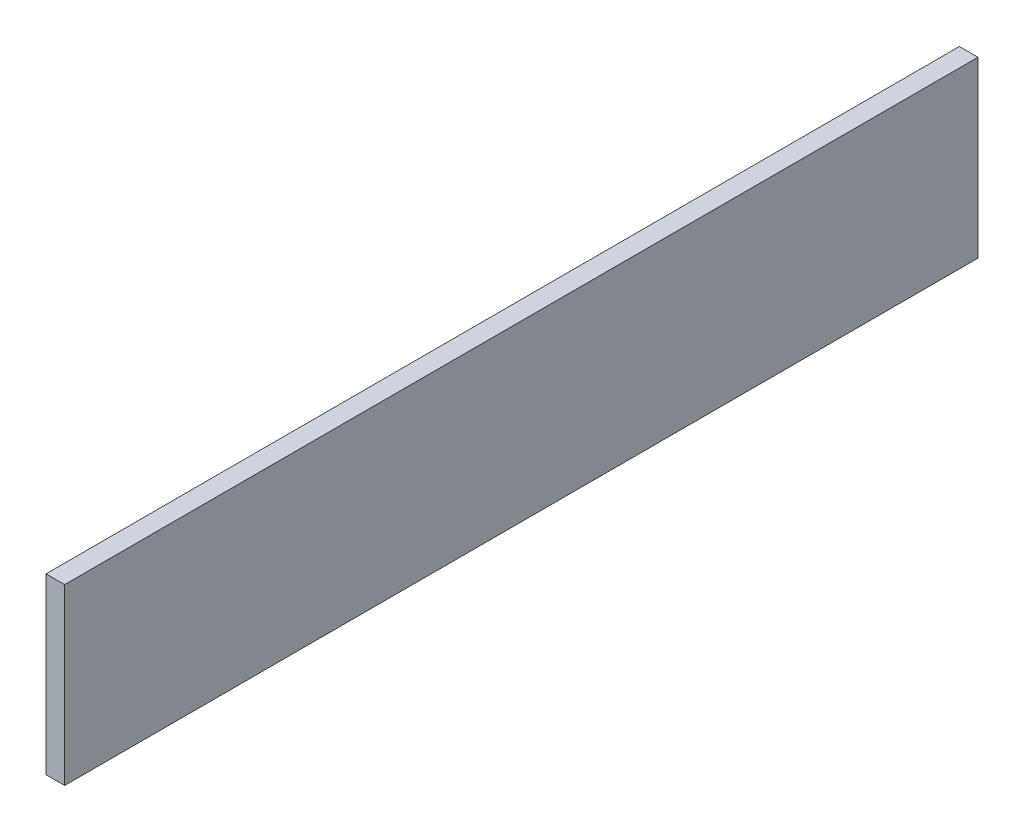
ISO-10303-21;
HEADER;
FILE_DESCRIPTION(('STEP AP214'),'2;1');
FILE_NAME('part.step','',(''),(''),'','','');
FILE_SCHEMA(('AUTOMOTIVE_DESIGN { 1 0 10303 214 1 1 1 1 }'));
ENDSEC;
DATA;
#1=APPLICATION_CONTEXT('core data for automotive mechanical design processes');
#2=APPLICATION_PROTOCOL_DEFINITION('international standard','automotive_design',2000,#1);
#3=PRODUCT_CONTEXT('',#1,'mechanical');
#4=PRODUCT('Part','Part','',(#3));
#5=PRODUCT_RELATED_PRODUCT_CATEGORY('part','',(#4));
#6=PRODUCT_DEFINITION_FORMATION('','',#4);
#7=PRODUCT_DEFINITION_CONTEXT('part definition',#1,'design');
#8=PRODUCT_DEFINITION('design','',#6,#7);
#9=PRODUCT_DEFINITION_SHAPE('','',#8);
#10=(LENGTH_UNIT() NAMED_UNIT(*) SI_UNIT(.MILLI.,.METRE.));
#11=(NAMED_UNIT(*) PLANE_ANGLE_UNIT() SI_UNIT($,.RADIAN.));
#12=(NAMED_UNIT(*) SI_UNIT($,.STERADIAN.) SOLID_ANGLE_UNIT());
#13=UNCERTAINTY_MEASURE_WITH_UNIT(LENGTH_MEASURE(1.E-05),#10,'distance_accuracy_value','');
#14=(GEOMETRIC_REPRESENTATION_CONTEXT(3) GLOBAL_UNCERTAINTY_ASSIGNED_CONTEXT((#13)) GLOBAL_UNIT_ASSIGNED_CONTEXT((#10,
#11,#12)) REPRESENTATION_CONTEXT('',''));
#15=CARTESIAN_POINT('',(0.,0.,0.));
#16=DIRECTION('',(0.,0.,1.));
#17=DIRECTION('',(1.,0.,0.));
#18=AXIS2_PLACEMENT_3D('',#15,#16,#17);
#19=CARTESIAN_POINT('',(-3.,0.,0.));
#20=DIRECTION('',(0.,0.,1.));
#21=DIRECTION('',(1.,0.,0.));
#22=AXIS2_PLACEMENT_3D('',#19,#20,#21);
#23=PLANE('',#22);
#24=DIRECTION('',(0.,-1.,0.));
#25=VECTOR('',#24,1.);
#26=CARTESIAN_POINT('',(0.,0.,0.));
#27=LINE('',#26,#25);
#28=CARTESIAN_POINT('',(0.,28.,0.));
#29=VERTEX_POINT('',#28);
#30=CARTESIAN_POINT('',(0.,0.,0.));
#31=VERTEX_POINT('',#30);
#32=EDGE_CURVE('E99',#29,#31,#27,.T.);
#33=ORIENTED_EDGE('',*,*,#32,.F.);
#34=DIRECTION('',(1.,0.,0.));
#35=VECTOR('',#34,1.);
#36=CARTESIAN_POINT('',(-3.,28.,0.));
#37=LINE('',#36,#35);
#38=CARTESIAN_POINT('',(-3.,28.,0.));
#39=VERTEX_POINT('',#38);
#40=EDGE_CURVE('E11',#39,#29,#37,.T.);
#41=ORIENTED_EDGE('',*,*,#40,.F.);
#42=DIRECTION('',(0.,-1.,0.));
#43=VECTOR('',#42,1.);
#44=CARTESIAN_POINT('',(-3.,0.,0.));
#45=LINE('',#44,#43);
#46=CARTESIAN_POINT('',(-3.,0.,0.));
#47=VERTEX_POINT('',#46);
#48=EDGE_CURVE('E93',#39,#47,#45,.T.);
#49=ORIENTED_EDGE('',*,*,#48,.T.);
#50=DIRECTION('',(1.,0.,0.));
#51=VECTOR('',#50,1.);
#52=CARTESIAN_POINT('',(-3.,0.,0.));
#53=LINE('',#52,#51);
#54=EDGE_CURVE('E38',#47,#31,#53,.T.);
#55=ORIENTED_EDGE('',*,*,#54,.T.);
#56=EDGE_LOOP('',(#33,#41,#49,#55));
#57=FACE_BOUND('',#56,.T.);
#58=ADVANCED_FACE('F35',(#57),#23,.T.);
#59=CARTESIAN_POINT('',(-3.,28.,0.));
#60=DIRECTION('',(0.,1.,0.));
#61=DIRECTION('',(0.,0.,1.));
#62=AXIS2_PLACEMENT_3D('',#59,#60,#61);
#63=PLANE('',#62);
#64=DIRECTION('',(0.,0.,1.));
#65=VECTOR('',#64,1.);
#66=CARTESIAN_POINT('',(0.,28.,0.));
#67=LINE('',#66,#65);
#68=CARTESIAN_POINT('',(0.,28.,-147.));
#69=VERTEX_POINT('',#68);
#70=EDGE_CURVE('E95',#69,#29,#67,.T.);
#71=ORIENTED_EDGE('',*,*,#70,.F.);
#72=DIRECTION('',(1.,0.,0.));
#73=VECTOR('',#72,1.);
#74=CARTESIAN_POINT('',(-3.,28.,-147.));
#75=LINE('',#74,#73);
#76=CARTESIAN_POINT('',(-3.,28.,-147.));
#77=VERTEX_POINT('',#76);
#78=EDGE_CURVE('E44',#77,#69,#75,.T.);
#79=ORIENTED_EDGE('',*,*,#78,.F.);
#80=DIRECTION('',(0.,0.,1.));
#81=VECTOR('',#80,1.);
#82=CARTESIAN_POINT('',(-3.,28.,0.));
#83=LINE('',#82,#81);
#84=EDGE_CURVE('E90',#77,#39,#83,.T.);
#85=ORIENTED_EDGE('',*,*,#84,.T.);
#86=ORIENTED_EDGE('',*,*,#40,.T.);
#87=EDGE_LOOP('',(#71,#79,#85,#86));
#88=FACE_BOUND('',#87,.T.);
#89=ADVANCED_FACE('F109',(#88),#63,.T.);
#90=CARTESIAN_POINT('',(-3.,0.,-147.));
#91=DIRECTION('',(0.,0.,-1.));
#92=DIRECTION('',(-1.,0.,0.));
#93=AXIS2_PLACEMENT_3D('',#90,#91,#92);
#94=PLANE('',#93);
#95=DIRECTION('',(0.,1.,0.));
#96=VECTOR('',#95,1.);
#97=CARTESIAN_POINT('',(0.,0.,-147.));
#98=LINE('',#97,#96);
#99=CARTESIAN_POINT('',(0.,0.,-147.));
#100=VERTEX_POINT('',#99);
#101=EDGE_CURVE('E85',#100,#69,#98,.T.);
#102=ORIENTED_EDGE('',*,*,#101,.F.);
#103=DIRECTION('',(1.,0.,0.));
#104=VECTOR('',#103,1.);
#105=CARTESIAN_POINT('',(-3.,0.,-147.));
#106=LINE('',#105,#104);
#107=CARTESIAN_POINT('',(-3.,0.,-147.));
#108=VERTEX_POINT('',#107);
#109=EDGE_CURVE('E80',#108,#100,#106,.T.);
#110=ORIENTED_EDGE('',*,*,#109,.F.);
#111=DIRECTION('',(0.,1.,0.));
#112=VECTOR('',#111,1.);
#113=CARTESIAN_POINT('',(-3.,0.,-147.));
#114=LINE('',#113,#112);
#115=EDGE_CURVE('E83',#108,#77,#114,.T.);
#116=ORIENTED_EDGE('',*,*,#115,.T.);
#117=ORIENTED_EDGE('',*,*,#78,.T.);
#118=EDGE_LOOP('',(#102,#110,#116,#117));
#119=FACE_BOUND('',#118,.T.);
#120=ADVANCED_FACE('F82',(#119),#94,.T.);
#121=CARTESIAN_POINT('',(-3.,0.,0.));
#122=DIRECTION('',(0.,-1.,0.));
#123=DIRECTION('',(0.,0.,-1.));
#124=AXIS2_PLACEMENT_3D('',#121,#122,#123);
#125=PLANE('',#124);
#126=DIRECTION('',(0.,0.,-1.));
#127=VECTOR('',#126,1.);
#128=CARTESIAN_POINT('',(0.,0.,0.));
#129=LINE('',#128,#127);
#130=EDGE_CURVE('E102',#31,#100,#129,.T.);
#131=ORIENTED_EDGE('',*,*,#130,.F.);
#132=ORIENTED_EDGE('',*,*,#54,.F.);
#133=DIRECTION('',(0.,0.,-1.));
#134=VECTOR('',#133,1.);
#135=CARTESIAN_POINT('',(-3.,0.,0.));
#136=LINE('',#135,#134);
#137=EDGE_CURVE('E89',#47,#108,#136,.T.);
#138=ORIENTED_EDGE('',*,*,#137,.T.);
#139=ORIENTED_EDGE('',*,*,#109,.T.);
#140=EDGE_LOOP('',(#131,#132,#138,#139));
#141=FACE_BOUND('',#140,.T.);
#142=ADVANCED_FACE('F92',(#141),#125,.T.);
#143=CARTESIAN_POINT('',(-3.,0.,0.));
#144=DIRECTION('',(-1.,0.,0.));
#145=DIRECTION('',(0.,0.,1.));
#146=AXIS2_PLACEMENT_3D('',#143,#144,#145);
#147=PLANE('',#146);
#148=ORIENTED_EDGE('',*,*,#48,.F.);
#149=ORIENTED_EDGE('',*,*,#84,.F.);
#150=ORIENTED_EDGE('',*,*,#115,.F.);
#151=ORIENTED_EDGE('',*,*,#137,.F.);
#152=EDGE_LOOP('',(#148,#149,#150,#151));
#153=FACE_BOUND('',#152,.T.);
#154=ADVANCED_FACE('F88',(#153),#147,.T.);
#155=CARTESIAN_POINT('',(0.,0.,0.));
#156=DIRECTION('',(-1.,0.,0.));
#157=DIRECTION('',(0.,0.,1.));
#158=AXIS2_PLACEMENT_3D('',#155,#156,#157);
#159=PLANE('',#158);
#160=ORIENTED_EDGE('',*,*,#32,.T.);
#161=ORIENTED_EDGE('',*,*,#130,.T.);
#162=ORIENTED_EDGE('',*,*,#101,.T.);
#163=ORIENTED_EDGE('',*,*,#70,.T.);
#164=EDGE_LOOP('',(#160,#161,#162,#163));
#165=FACE_BOUND('',#164,.T.);
#166=ADVANCED_FACE('F108',(#165),#159,.F.);
#167=CLOSED_SHELL('',(#58,#89,#120,#142,#154,#166));
#168=MANIFOLD_SOLID_BREP('B2',#167);
#169=ADVANCED_BREP_SHAPE_REPRESENTATION('',(#18,#168),#14);
#170=SHAPE_DEFINITION_REPRESENTATION(#9,#169);
ENDSEC;
END-ISO-10303-21;
